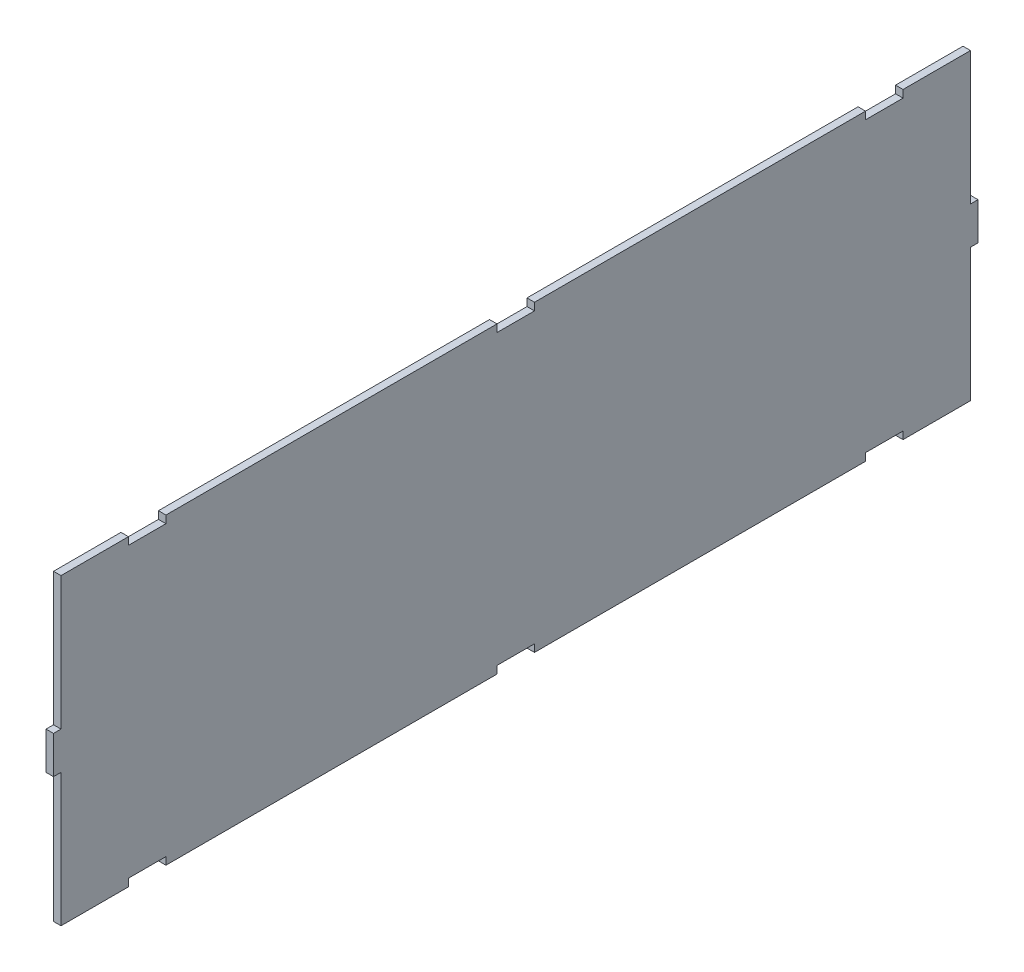
ISO-10303-21;
HEADER;
FILE_DESCRIPTION(('STEP AP214'),'2;1');
FILE_NAME('part.step','',(''),(''),'','','');
FILE_SCHEMA(('AUTOMOTIVE_DESIGN { 1 0 10303 214 1 1 1 1 }'));
ENDSEC;
DATA;
#1=APPLICATION_CONTEXT('core data for automotive mechanical design processes');
#2=APPLICATION_PROTOCOL_DEFINITION('international standard','automotive_design',2000,#1);
#3=PRODUCT_CONTEXT('',#1,'mechanical');
#4=PRODUCT('Part','Part','',(#3));
#5=PRODUCT_RELATED_PRODUCT_CATEGORY('part','',(#4));
#6=PRODUCT_DEFINITION_FORMATION('','',#4);
#7=PRODUCT_DEFINITION_CONTEXT('part definition',#1,'design');
#8=PRODUCT_DEFINITION('design','',#6,#7);
#9=PRODUCT_DEFINITION_SHAPE('','',#8);
#10=(LENGTH_UNIT() NAMED_UNIT(*) SI_UNIT(.MILLI.,.METRE.));
#11=(NAMED_UNIT(*) PLANE_ANGLE_UNIT() SI_UNIT($,.RADIAN.));
#12=(NAMED_UNIT(*) SI_UNIT($,.STERADIAN.) SOLID_ANGLE_UNIT());
#13=UNCERTAINTY_MEASURE_WITH_UNIT(LENGTH_MEASURE(1.E-05),#10,'distance_accuracy_value','');
#14=(GEOMETRIC_REPRESENTATION_CONTEXT(3) GLOBAL_UNCERTAINTY_ASSIGNED_CONTEXT((#13)) GLOBAL_UNIT_ASSIGNED_CONTEXT((#10,
#11,#12)) REPRESENTATION_CONTEXT('',''));
#15=CARTESIAN_POINT('',(0.,0.,0.));
#16=DIRECTION('',(0.,0.,1.));
#17=DIRECTION('',(1.,0.,0.));
#18=AXIS2_PLACEMENT_3D('',#15,#16,#17);
#19=CARTESIAN_POINT('',(3.,-53.19,-367.));
#20=DIRECTION('',(0.,0.,1.));
#21=DIRECTION('',(1.,0.,0.));
#22=AXIS2_PLACEMENT_3D('',#19,#20,#21);
#23=PLANE('',#22);
#24=DIRECTION('',(0.,1.,0.));
#25=VECTOR('',#24,1.);
#26=CARTESIAN_POINT('',(0.,-53.19,-367.));
#27=LINE('',#26,#25);
#28=CARTESIAN_POINT('',(0.,-53.19,-367.));
#29=VERTEX_POINT('',#28);
#30=CARTESIAN_POINT('',(0.,0.,-367.));
#31=VERTEX_POINT('',#30);
#32=EDGE_CURVE('E300',#29,#31,#27,.T.);
#33=ORIENTED_EDGE('',*,*,#32,.T.);
#34=DIRECTION('',(-1.,0.,0.));
#35=VECTOR('',#34,1.);
#36=CARTESIAN_POINT('',(3.,0.,-367.));
#37=LINE('',#36,#35);
#38=CARTESIAN_POINT('',(3.,0.,-367.));
#39=VERTEX_POINT('',#38);
#40=EDGE_CURVE('E11',#39,#31,#37,.T.);
#41=ORIENTED_EDGE('',*,*,#40,.F.);
#42=DIRECTION('',(0.,1.,0.));
#43=VECTOR('',#42,1.);
#44=CARTESIAN_POINT('',(3.,-53.19,-367.));
#45=LINE('',#44,#43);
#46=CARTESIAN_POINT('',(3.,-53.19,-367.));
#47=VERTEX_POINT('',#46);
#48=EDGE_CURVE('E370',#47,#39,#45,.T.);
#49=ORIENTED_EDGE('',*,*,#48,.F.);
#50=DIRECTION('',(-1.,0.,0.));
#51=VECTOR('',#50,1.);
#52=CARTESIAN_POINT('',(3.,-53.19,-367.));
#53=LINE('',#52,#51);
#54=EDGE_CURVE('E296',#47,#29,#53,.T.);
#55=ORIENTED_EDGE('',*,*,#54,.T.);
#56=EDGE_LOOP('',(#33,#41,#49,#55));
#57=FACE_BOUND('',#56,.T.);
#58=ADVANCED_FACE('F36',(#57),#23,.F.);
#59=CARTESIAN_POINT('',(3.,0.,-340.));
#60=DIRECTION('',(0.,-1.,0.));
#61=DIRECTION('',(0.,0.,-1.));
#62=AXIS2_PLACEMENT_3D('',#59,#60,#61);
#63=PLANE('',#62);
#64=DIRECTION('',(0.,0.,1.));
#65=VECTOR('',#64,1.);
#66=CARTESIAN_POINT('',(0.,0.,-340.));
#67=LINE('',#66,#65);
#68=CARTESIAN_POINT('',(0.,0.,-340.));
#69=VERTEX_POINT('',#68);
#70=EDGE_CURVE('E303',#31,#69,#67,.T.);
#71=ORIENTED_EDGE('',*,*,#70,.T.);
#72=DIRECTION('',(-1.,0.,0.));
#73=VECTOR('',#72,1.);
#74=CARTESIAN_POINT('',(3.,0.,-340.));
#75=LINE('',#74,#73);
#76=CARTESIAN_POINT('',(3.,0.,-340.));
#77=VERTEX_POINT('',#76);
#78=EDGE_CURVE('E44',#77,#69,#75,.T.);
#79=ORIENTED_EDGE('',*,*,#78,.F.);
#80=DIRECTION('',(0.,0.,1.));
#81=VECTOR('',#80,1.);
#82=CARTESIAN_POINT('',(3.,0.,-340.));
#83=LINE('',#82,#81);
#84=EDGE_CURVE('E179',#39,#77,#83,.T.);
#85=ORIENTED_EDGE('',*,*,#84,.F.);
#86=ORIENTED_EDGE('',*,*,#40,.T.);
#87=EDGE_LOOP('',(#71,#79,#85,#86));
#88=FACE_BOUND('',#87,.T.);
#89=ADVANCED_FACE('F568',(#88),#63,.F.);
#90=CARTESIAN_POINT('',(3.,0.,-340.));
#91=DIRECTION('',(0.,0.,-1.));
#92=DIRECTION('',(-1.,0.,0.));
#93=AXIS2_PLACEMENT_3D('',#90,#91,#92);
#94=PLANE('',#93);
#95=DIRECTION('',(0.,-1.,0.));
#96=VECTOR('',#95,1.);
#97=CARTESIAN_POINT('',(0.,0.,-340.));
#98=LINE('',#97,#96);
#99=CARTESIAN_POINT('',(0.,-3.,-340.));
#100=VERTEX_POINT('',#99);
#101=EDGE_CURVE('E305',#69,#100,#98,.T.);
#102=ORIENTED_EDGE('',*,*,#101,.T.);
#103=DIRECTION('',(-1.,0.,0.));
#104=VECTOR('',#103,1.);
#105=CARTESIAN_POINT('',(3.,-3.,-340.));
#106=LINE('',#105,#104);
#107=CARTESIAN_POINT('',(3.,-3.,-340.));
#108=VERTEX_POINT('',#107);
#109=EDGE_CURVE('E461',#108,#100,#106,.T.);
#110=ORIENTED_EDGE('',*,*,#109,.F.);
#111=DIRECTION('',(0.,-1.,0.));
#112=VECTOR('',#111,1.);
#113=CARTESIAN_POINT('',(3.,0.,-340.));
#114=LINE('',#113,#112);
#115=EDGE_CURVE('E469',#77,#108,#114,.T.);
#116=ORIENTED_EDGE('',*,*,#115,.F.);
#117=ORIENTED_EDGE('',*,*,#78,.T.);
#118=EDGE_LOOP('',(#102,#110,#116,#117));
#119=FACE_BOUND('',#118,.T.);
#120=ADVANCED_FACE('F467',(#119),#94,.F.);
#121=CARTESIAN_POINT('',(3.,-3.,-340.));
#122=DIRECTION('',(0.,-1.,0.));
#123=DIRECTION('',(0.,0.,-1.));
#124=AXIS2_PLACEMENT_3D('',#121,#122,#123);
#125=PLANE('',#124);
#126=DIRECTION('',(0.,0.,1.));
#127=VECTOR('',#126,1.);
#128=CARTESIAN_POINT('',(0.,-3.,-340.));
#129=LINE('',#128,#127);
#130=CARTESIAN_POINT('',(0.,-3.,-325.));
#131=VERTEX_POINT('',#130);
#132=EDGE_CURVE('E307',#100,#131,#129,.T.);
#133=ORIENTED_EDGE('',*,*,#132,.T.);
#134=DIRECTION('',(-1.,0.,0.));
#135=VECTOR('',#134,1.);
#136=CARTESIAN_POINT('',(3.,-3.,-325.));
#137=LINE('',#136,#135);
#138=CARTESIAN_POINT('',(3.,-3.,-325.));
#139=VERTEX_POINT('',#138);
#140=EDGE_CURVE('E458',#139,#131,#137,.T.);
#141=ORIENTED_EDGE('',*,*,#140,.F.);
#142=DIRECTION('',(0.,0.,1.));
#143=VECTOR('',#142,1.);
#144=CARTESIAN_POINT('',(3.,-3.,-340.));
#145=LINE('',#144,#143);
#146=EDGE_CURVE('E487',#108,#139,#145,.T.);
#147=ORIENTED_EDGE('',*,*,#146,.F.);
#148=ORIENTED_EDGE('',*,*,#109,.T.);
#149=EDGE_LOOP('',(#133,#141,#147,#148));
#150=FACE_BOUND('',#149,.T.);
#151=ADVANCED_FACE('F478',(#150),#125,.F.);
#152=CARTESIAN_POINT('',(3.,-3.,-325.));
#153=DIRECTION('',(0.,0.,1.));
#154=DIRECTION('',(1.,0.,0.));
#155=AXIS2_PLACEMENT_3D('',#152,#153,#154);
#156=PLANE('',#155);
#157=DIRECTION('',(0.,1.,0.));
#158=VECTOR('',#157,1.);
#159=CARTESIAN_POINT('',(0.,-3.,-325.));
#160=LINE('',#159,#158);
#161=CARTESIAN_POINT('',(0.,0.,-325.));
#162=VERTEX_POINT('',#161);
#163=EDGE_CURVE('E309',#131,#162,#160,.T.);
#164=ORIENTED_EDGE('',*,*,#163,.T.);
#165=DIRECTION('',(-1.,0.,0.));
#166=VECTOR('',#165,1.);
#167=CARTESIAN_POINT('',(3.,0.,-325.));
#168=LINE('',#167,#166);
#169=CARTESIAN_POINT('',(3.,0.,-325.));
#170=VERTEX_POINT('',#169);
#171=EDGE_CURVE('E455',#170,#162,#168,.T.);
#172=ORIENTED_EDGE('',*,*,#171,.F.);
#173=DIRECTION('',(0.,1.,0.));
#174=VECTOR('',#173,1.);
#175=CARTESIAN_POINT('',(3.,-3.,-325.));
#176=LINE('',#175,#174);
#177=EDGE_CURVE('E484',#139,#170,#176,.T.);
#178=ORIENTED_EDGE('',*,*,#177,.F.);
#179=ORIENTED_EDGE('',*,*,#140,.T.);
#180=EDGE_LOOP('',(#164,#172,#178,#179));
#181=FACE_BOUND('',#180,.T.);
#182=ADVANCED_FACE('F482',(#181),#156,.F.);
#183=CARTESIAN_POINT('',(3.,0.,-192.5));
#184=DIRECTION('',(0.,-1.,0.));
#185=DIRECTION('',(0.,0.,-1.));
#186=AXIS2_PLACEMENT_3D('',#183,#184,#185);
#187=PLANE('',#186);
#188=DIRECTION('',(0.,0.,1.));
#189=VECTOR('',#188,1.);
#190=CARTESIAN_POINT('',(0.,0.,-192.5));
#191=LINE('',#190,#189);
#192=CARTESIAN_POINT('',(0.,0.,-192.5));
#193=VERTEX_POINT('',#192);
#194=EDGE_CURVE('E311',#162,#193,#191,.T.);
#195=ORIENTED_EDGE('',*,*,#194,.T.);
#196=DIRECTION('',(-1.,0.,0.));
#197=VECTOR('',#196,1.);
#198=CARTESIAN_POINT('',(3.,0.,-192.5));
#199=LINE('',#198,#197);
#200=CARTESIAN_POINT('',(3.,0.,-192.5));
#201=VERTEX_POINT('',#200);
#202=EDGE_CURVE('E452',#201,#193,#199,.T.);
#203=ORIENTED_EDGE('',*,*,#202,.F.);
#204=DIRECTION('',(0.,0.,1.));
#205=VECTOR('',#204,1.);
#206=CARTESIAN_POINT('',(3.,0.,-192.5));
#207=LINE('',#206,#205);
#208=EDGE_CURVE('E486',#170,#201,#207,.T.);
#209=ORIENTED_EDGE('',*,*,#208,.F.);
#210=ORIENTED_EDGE('',*,*,#171,.T.);
#211=EDGE_LOOP('',(#195,#203,#209,#210));
#212=FACE_BOUND('',#211,.T.);
#213=ADVANCED_FACE('F581',(#212),#187,.F.);
#214=CARTESIAN_POINT('',(3.,-3.,-192.5));
#215=DIRECTION('',(0.,0.,-1.));
#216=DIRECTION('',(-1.,0.,0.));
#217=AXIS2_PLACEMENT_3D('',#214,#215,#216);
#218=PLANE('',#217);
#219=DIRECTION('',(0.,-1.,0.));
#220=VECTOR('',#219,1.);
#221=CARTESIAN_POINT('',(0.,-3.,-192.5));
#222=LINE('',#221,#220);
#223=CARTESIAN_POINT('',(0.,-3.,-192.5));
#224=VERTEX_POINT('',#223);
#225=EDGE_CURVE('E313',#193,#224,#222,.T.);
#226=ORIENTED_EDGE('',*,*,#225,.T.);
#227=DIRECTION('',(-1.,0.,0.));
#228=VECTOR('',#227,1.);
#229=CARTESIAN_POINT('',(3.,-3.,-192.5));
#230=LINE('',#229,#228);
#231=CARTESIAN_POINT('',(3.,-3.,-192.5));
#232=VERTEX_POINT('',#231);
#233=EDGE_CURVE('E449',#232,#224,#230,.T.);
#234=ORIENTED_EDGE('',*,*,#233,.F.);
#235=DIRECTION('',(0.,-1.,0.));
#236=VECTOR('',#235,1.);
#237=CARTESIAN_POINT('',(3.,-3.,-192.5));
#238=LINE('',#237,#236);
#239=EDGE_CURVE('E489',#201,#232,#238,.T.);
#240=ORIENTED_EDGE('',*,*,#239,.F.);
#241=ORIENTED_EDGE('',*,*,#202,.T.);
#242=EDGE_LOOP('',(#226,#234,#240,#241));
#243=FACE_BOUND('',#242,.T.);
#244=ADVANCED_FACE('F584',(#243),#218,.F.);
#245=CARTESIAN_POINT('',(3.,-3.,-177.5));
#246=DIRECTION('',(0.,-1.,0.));
#247=DIRECTION('',(0.,0.,-1.));
#248=AXIS2_PLACEMENT_3D('',#245,#246,#247);
#249=PLANE('',#248);
#250=DIRECTION('',(0.,0.,1.));
#251=VECTOR('',#250,1.);
#252=CARTESIAN_POINT('',(0.,-3.,-177.5));
#253=LINE('',#252,#251);
#254=CARTESIAN_POINT('',(0.,-3.,-177.5));
#255=VERTEX_POINT('',#254);
#256=EDGE_CURVE('E315',#224,#255,#253,.T.);
#257=ORIENTED_EDGE('',*,*,#256,.T.);
#258=DIRECTION('',(-1.,0.,0.));
#259=VECTOR('',#258,1.);
#260=CARTESIAN_POINT('',(3.,-3.,-177.5));
#261=LINE('',#260,#259);
#262=CARTESIAN_POINT('',(3.,-3.,-177.5));
#263=VERTEX_POINT('',#262);
#264=EDGE_CURVE('E446',#263,#255,#261,.T.);
#265=ORIENTED_EDGE('',*,*,#264,.F.);
#266=DIRECTION('',(0.,0.,1.));
#267=VECTOR('',#266,1.);
#268=CARTESIAN_POINT('',(3.,-3.,-177.5));
#269=LINE('',#268,#267);
#270=EDGE_CURVE('E495',#232,#263,#269,.T.);
#271=ORIENTED_EDGE('',*,*,#270,.F.);
#272=ORIENTED_EDGE('',*,*,#233,.T.);
#273=EDGE_LOOP('',(#257,#265,#271,#272));
#274=FACE_BOUND('',#273,.T.);
#275=ADVANCED_FACE('F588',(#274),#249,.F.);
#276=CARTESIAN_POINT('',(3.,-3.,-177.5));
#277=DIRECTION('',(0.,0.,1.));
#278=DIRECTION('',(1.,0.,0.));
#279=AXIS2_PLACEMENT_3D('',#276,#277,#278);
#280=PLANE('',#279);
#281=DIRECTION('',(0.,1.,0.));
#282=VECTOR('',#281,1.);
#283=CARTESIAN_POINT('',(0.,-3.,-177.5));
#284=LINE('',#283,#282);
#285=CARTESIAN_POINT('',(0.,0.,-177.5));
#286=VERTEX_POINT('',#285);
#287=EDGE_CURVE('E317',#255,#286,#284,.T.);
#288=ORIENTED_EDGE('',*,*,#287,.T.);
#289=DIRECTION('',(-1.,0.,0.));
#290=VECTOR('',#289,1.);
#291=CARTESIAN_POINT('',(3.,0.,-177.5));
#292=LINE('',#291,#290);
#293=CARTESIAN_POINT('',(3.,0.,-177.5));
#294=VERTEX_POINT('',#293);
#295=EDGE_CURVE('E443',#294,#286,#292,.T.);
#296=ORIENTED_EDGE('',*,*,#295,.F.);
#297=DIRECTION('',(0.,1.,0.));
#298=VECTOR('',#297,1.);
#299=CARTESIAN_POINT('',(3.,-3.,-177.5));
#300=LINE('',#299,#298);
#301=EDGE_CURVE('E497',#263,#294,#300,.T.);
#302=ORIENTED_EDGE('',*,*,#301,.F.);
#303=ORIENTED_EDGE('',*,*,#264,.T.);
#304=EDGE_LOOP('',(#288,#296,#302,#303));
#305=FACE_BOUND('',#304,.T.);
#306=ADVANCED_FACE('F592',(#305),#280,.F.);
#307=CARTESIAN_POINT('',(3.,0.,-45.));
#308=DIRECTION('',(0.,-1.,0.));
#309=DIRECTION('',(0.,0.,-1.));
#310=AXIS2_PLACEMENT_3D('',#307,#308,#309);
#311=PLANE('',#310);
#312=DIRECTION('',(0.,0.,1.));
#313=VECTOR('',#312,1.);
#314=CARTESIAN_POINT('',(0.,0.,-45.));
#315=LINE('',#314,#313);
#316=CARTESIAN_POINT('',(0.,0.,-45.));
#317=VERTEX_POINT('',#316);
#318=EDGE_CURVE('E319',#286,#317,#315,.T.);
#319=ORIENTED_EDGE('',*,*,#318,.T.);
#320=DIRECTION('',(-1.,0.,0.));
#321=VECTOR('',#320,1.);
#322=CARTESIAN_POINT('',(3.,0.,-45.));
#323=LINE('',#322,#321);
#324=CARTESIAN_POINT('',(3.,0.,-45.));
#325=VERTEX_POINT('',#324);
#326=EDGE_CURVE('E440',#325,#317,#323,.T.);
#327=ORIENTED_EDGE('',*,*,#326,.F.);
#328=DIRECTION('',(0.,0.,1.));
#329=VECTOR('',#328,1.);
#330=CARTESIAN_POINT('',(3.,0.,-45.));
#331=LINE('',#330,#329);
#332=EDGE_CURVE('E499',#294,#325,#331,.T.);
#333=ORIENTED_EDGE('',*,*,#332,.F.);
#334=ORIENTED_EDGE('',*,*,#295,.T.);
#335=EDGE_LOOP('',(#319,#327,#333,#334));
#336=FACE_BOUND('',#335,.T.);
#337=ADVANCED_FACE('F596',(#336),#311,.F.);
#338=CARTESIAN_POINT('',(3.,-3.,-45.));
#339=DIRECTION('',(0.,0.,-1.));
#340=DIRECTION('',(-1.,0.,0.));
#341=AXIS2_PLACEMENT_3D('',#338,#339,#340);
#342=PLANE('',#341);
#343=DIRECTION('',(0.,-1.,0.));
#344=VECTOR('',#343,1.);
#345=CARTESIAN_POINT('',(0.,-3.,-45.));
#346=LINE('',#345,#344);
#347=CARTESIAN_POINT('',(0.,-3.,-45.));
#348=VERTEX_POINT('',#347);
#349=EDGE_CURVE('E321',#317,#348,#346,.T.);
#350=ORIENTED_EDGE('',*,*,#349,.T.);
#351=DIRECTION('',(-1.,0.,0.));
#352=VECTOR('',#351,1.);
#353=CARTESIAN_POINT('',(3.,-3.,-45.));
#354=LINE('',#353,#352);
#355=CARTESIAN_POINT('',(3.,-3.,-45.));
#356=VERTEX_POINT('',#355);
#357=EDGE_CURVE('E437',#356,#348,#354,.T.);
#358=ORIENTED_EDGE('',*,*,#357,.F.);
#359=DIRECTION('',(0.,-1.,0.));
#360=VECTOR('',#359,1.);
#361=CARTESIAN_POINT('',(3.,-3.,-45.));
#362=LINE('',#361,#360);
#363=EDGE_CURVE('E501',#325,#356,#362,.T.);
#364=ORIENTED_EDGE('',*,*,#363,.F.);
#365=ORIENTED_EDGE('',*,*,#326,.T.);
#366=EDGE_LOOP('',(#350,#358,#364,#365));
#367=FACE_BOUND('',#366,.T.);
#368=ADVANCED_FACE('F600',(#367),#342,.F.);
#369=CARTESIAN_POINT('',(3.,-3.,-30.));
#370=DIRECTION('',(0.,-1.,0.));
#371=DIRECTION('',(0.,0.,-1.));
#372=AXIS2_PLACEMENT_3D('',#369,#370,#371);
#373=PLANE('',#372);
#374=DIRECTION('',(0.,0.,1.));
#375=VECTOR('',#374,1.);
#376=CARTESIAN_POINT('',(0.,-3.,-30.));
#377=LINE('',#376,#375);
#378=CARTESIAN_POINT('',(0.,-3.,-30.));
#379=VERTEX_POINT('',#378);
#380=EDGE_CURVE('E323',#348,#379,#377,.T.);
#381=ORIENTED_EDGE('',*,*,#380,.T.);
#382=DIRECTION('',(-1.,0.,0.));
#383=VECTOR('',#382,1.);
#384=CARTESIAN_POINT('',(3.,-3.,-30.));
#385=LINE('',#384,#383);
#386=CARTESIAN_POINT('',(3.,-3.,-30.));
#387=VERTEX_POINT('',#386);
#388=EDGE_CURVE('E434',#387,#379,#385,.T.);
#389=ORIENTED_EDGE('',*,*,#388,.F.);
#390=DIRECTION('',(0.,0.,1.));
#391=VECTOR('',#390,1.);
#392=CARTESIAN_POINT('',(3.,-3.,-30.));
#393=LINE('',#392,#391);
#394=EDGE_CURVE('E503',#356,#387,#393,.T.);
#395=ORIENTED_EDGE('',*,*,#394,.F.);
#396=ORIENTED_EDGE('',*,*,#357,.T.);
#397=EDGE_LOOP('',(#381,#389,#395,#396));
#398=FACE_BOUND('',#397,.T.);
#399=ADVANCED_FACE('F604',(#398),#373,.F.);
#400=CARTESIAN_POINT('',(3.,0.,-30.));
#401=DIRECTION('',(0.,0.,1.));
#402=DIRECTION('',(1.,0.,0.));
#403=AXIS2_PLACEMENT_3D('',#400,#401,#402);
#404=PLANE('',#403);
#405=DIRECTION('',(0.,1.,0.));
#406=VECTOR('',#405,1.);
#407=CARTESIAN_POINT('',(0.,0.,-30.));
#408=LINE('',#407,#406);
#409=CARTESIAN_POINT('',(0.,0.,-30.));
#410=VERTEX_POINT('',#409);
#411=EDGE_CURVE('E325',#379,#410,#408,.T.);
#412=ORIENTED_EDGE('',*,*,#411,.T.);
#413=DIRECTION('',(-1.,0.,0.));
#414=VECTOR('',#413,1.);
#415=CARTESIAN_POINT('',(3.,0.,-30.));
#416=LINE('',#415,#414);
#417=CARTESIAN_POINT('',(3.,0.,-30.));
#418=VERTEX_POINT('',#417);
#419=EDGE_CURVE('E431',#418,#410,#416,.T.);
#420=ORIENTED_EDGE('',*,*,#419,.F.);
#421=DIRECTION('',(0.,1.,0.));
#422=VECTOR('',#421,1.);
#423=CARTESIAN_POINT('',(3.,0.,-30.));
#424=LINE('',#423,#422);
#425=EDGE_CURVE('E505',#387,#418,#424,.T.);
#426=ORIENTED_EDGE('',*,*,#425,.F.);
#427=ORIENTED_EDGE('',*,*,#388,.T.);
#428=EDGE_LOOP('',(#412,#420,#426,#427));
#429=FACE_BOUND('',#428,.T.);
#430=ADVANCED_FACE('F608',(#429),#404,.F.);
#431=CARTESIAN_POINT('',(3.,0.,-3.));
#432=DIRECTION('',(0.,-1.,0.));
#433=DIRECTION('',(0.,0.,-1.));
#434=AXIS2_PLACEMENT_3D('',#431,#432,#433);
#435=PLANE('',#434);
#436=DIRECTION('',(0.,0.,1.));
#437=VECTOR('',#436,1.);
#438=CARTESIAN_POINT('',(0.,0.,-3.));
#439=LINE('',#438,#437);
#440=CARTESIAN_POINT('',(0.,0.,-3.));
#441=VERTEX_POINT('',#440);
#442=EDGE_CURVE('E327',#410,#441,#439,.T.);
#443=ORIENTED_EDGE('',*,*,#442,.T.);
#444=DIRECTION('',(-1.,0.,0.));
#445=VECTOR('',#444,1.);
#446=CARTESIAN_POINT('',(3.,0.,-3.));
#447=LINE('',#446,#445);
#448=CARTESIAN_POINT('',(3.,0.,-3.));
#449=VERTEX_POINT('',#448);
#450=EDGE_CURVE('E428',#449,#441,#447,.T.);
#451=ORIENTED_EDGE('',*,*,#450,.F.);
#452=DIRECTION('',(0.,0.,1.));
#453=VECTOR('',#452,1.);
#454=CARTESIAN_POINT('',(3.,0.,-3.));
#455=LINE('',#454,#453);
#456=EDGE_CURVE('E507',#418,#449,#455,.T.);
#457=ORIENTED_EDGE('',*,*,#456,.F.);
#458=ORIENTED_EDGE('',*,*,#419,.T.);
#459=EDGE_LOOP('',(#443,#451,#457,#458));
#460=FACE_BOUND('',#459,.T.);
#461=ADVANCED_FACE('F612',(#460),#435,.F.);
#462=CARTESIAN_POINT('',(3.,-53.19,-3.));
#463=DIRECTION('',(0.,0.,-1.));
#464=DIRECTION('',(-1.,0.,0.));
#465=AXIS2_PLACEMENT_3D('',#462,#463,#464);
#466=PLANE('',#465);
#467=DIRECTION('',(0.,-1.,0.));
#468=VECTOR('',#467,1.);
#469=CARTESIAN_POINT('',(0.,-53.19,-3.));
#470=LINE('',#469,#468);
#471=CARTESIAN_POINT('',(0.,-53.19,-3.));
#472=VERTEX_POINT('',#471);
#473=EDGE_CURVE('E329',#441,#472,#470,.T.);
#474=ORIENTED_EDGE('',*,*,#473,.T.);
#475=DIRECTION('',(-1.,0.,0.));
#476=VECTOR('',#475,1.);
#477=CARTESIAN_POINT('',(3.,-53.19,-3.));
#478=LINE('',#477,#476);
#479=CARTESIAN_POINT('',(3.,-53.19,-3.));
#480=VERTEX_POINT('',#479);
#481=EDGE_CURVE('E425',#480,#472,#478,.T.);
#482=ORIENTED_EDGE('',*,*,#481,.F.);
#483=DIRECTION('',(0.,-1.,0.));
#484=VECTOR('',#483,1.);
#485=CARTESIAN_POINT('',(3.,-53.19,-3.));
#486=LINE('',#485,#484);
#487=EDGE_CURVE('E509',#449,#480,#486,.T.);
#488=ORIENTED_EDGE('',*,*,#487,.F.);
#489=ORIENTED_EDGE('',*,*,#450,.T.);
#490=EDGE_LOOP('',(#474,#482,#488,#489));
#491=FACE_BOUND('',#490,.T.);
#492=ADVANCED_FACE('F616',(#491),#466,.F.);
#493=CARTESIAN_POINT('',(3.,-53.19,-3.));
#494=DIRECTION('',(0.,-1.,0.));
#495=DIRECTION('',(0.,0.,-1.));
#496=AXIS2_PLACEMENT_3D('',#493,#494,#495);
#497=PLANE('',#496);
#498=DIRECTION('',(0.,0.,1.));
#499=VECTOR('',#498,1.);
#500=CARTESIAN_POINT('',(0.,-53.19,-3.));
#501=LINE('',#500,#499);
#502=CARTESIAN_POINT('',(0.,-53.19,0.));
#503=VERTEX_POINT('',#502);
#504=EDGE_CURVE('E331',#472,#503,#501,.T.);
#505=ORIENTED_EDGE('',*,*,#504,.T.);
#506=DIRECTION('',(-1.,0.,0.));
#507=VECTOR('',#506,1.);
#508=CARTESIAN_POINT('',(3.,-53.19,0.));
#509=LINE('',#508,#507);
#510=CARTESIAN_POINT('',(3.,-53.19,0.));
#511=VERTEX_POINT('',#510);
#512=EDGE_CURVE('E422',#511,#503,#509,.T.);
#513=ORIENTED_EDGE('',*,*,#512,.F.);
#514=DIRECTION('',(0.,0.,1.));
#515=VECTOR('',#514,1.);
#516=CARTESIAN_POINT('',(3.,-53.19,-3.));
#517=LINE('',#516,#515);
#518=EDGE_CURVE('E511',#480,#511,#517,.T.);
#519=ORIENTED_EDGE('',*,*,#518,.F.);
#520=ORIENTED_EDGE('',*,*,#481,.T.);
#521=EDGE_LOOP('',(#505,#513,#519,#520));
#522=FACE_BOUND('',#521,.T.);
#523=ADVANCED_FACE('F620',(#522),#497,.F.);
#524=CARTESIAN_POINT('',(3.,-53.19,0.));
#525=DIRECTION('',(0.,0.,-1.));
#526=DIRECTION('',(-1.,0.,0.));
#527=AXIS2_PLACEMENT_3D('',#524,#525,#526);
#528=PLANE('',#527);
#529=DIRECTION('',(0.,-1.,0.));
#530=VECTOR('',#529,1.);
#531=CARTESIAN_POINT('',(0.,-53.19,0.));
#532=LINE('',#531,#530);
#533=CARTESIAN_POINT('',(0.,-68.19,0.));
#534=VERTEX_POINT('',#533);
#535=EDGE_CURVE('E333',#503,#534,#532,.T.);
#536=ORIENTED_EDGE('',*,*,#535,.T.);
#537=DIRECTION('',(-1.,0.,0.));
#538=VECTOR('',#537,1.);
#539=CARTESIAN_POINT('',(3.,-68.19,0.));
#540=LINE('',#539,#538);
#541=CARTESIAN_POINT('',(3.,-68.19,0.));
#542=VERTEX_POINT('',#541);
#543=EDGE_CURVE('E419',#542,#534,#540,.T.);
#544=ORIENTED_EDGE('',*,*,#543,.F.);
#545=DIRECTION('',(0.,-1.,0.));
#546=VECTOR('',#545,1.);
#547=CARTESIAN_POINT('',(3.,-53.19,0.));
#548=LINE('',#547,#546);
#549=EDGE_CURVE('E513',#511,#542,#548,.T.);
#550=ORIENTED_EDGE('',*,*,#549,.F.);
#551=ORIENTED_EDGE('',*,*,#512,.T.);
#552=EDGE_LOOP('',(#536,#544,#550,#551));
#553=FACE_BOUND('',#552,.T.);
#554=ADVANCED_FACE('F624',(#553),#528,.F.);
#555=CARTESIAN_POINT('',(3.,-68.19,-3.));
#556=DIRECTION('',(0.,1.,0.));
#557=DIRECTION('',(0.,0.,1.));
#558=AXIS2_PLACEMENT_3D('',#555,#556,#557);
#559=PLANE('',#558);
#560=DIRECTION('',(0.,0.,-1.));
#561=VECTOR('',#560,1.);
#562=CARTESIAN_POINT('',(0.,-68.19,-3.));
#563=LINE('',#562,#561);
#564=CARTESIAN_POINT('',(0.,-68.19,-3.));
#565=VERTEX_POINT('',#564);
#566=EDGE_CURVE('E335',#534,#565,#563,.T.);
#567=ORIENTED_EDGE('',*,*,#566,.T.);
#568=DIRECTION('',(-1.,0.,0.));
#569=VECTOR('',#568,1.);
#570=CARTESIAN_POINT('',(3.,-68.19,-3.));
#571=LINE('',#570,#569);
#572=CARTESIAN_POINT('',(3.,-68.19,-3.));
#573=VERTEX_POINT('',#572);
#574=EDGE_CURVE('E416',#573,#565,#571,.T.);
#575=ORIENTED_EDGE('',*,*,#574,.F.);
#576=DIRECTION('',(0.,0.,-1.));
#577=VECTOR('',#576,1.);
#578=CARTESIAN_POINT('',(3.,-68.19,-3.));
#579=LINE('',#578,#577);
#580=EDGE_CURVE('E515',#542,#573,#579,.T.);
#581=ORIENTED_EDGE('',*,*,#580,.F.);
#582=ORIENTED_EDGE('',*,*,#543,.T.);
#583=EDGE_LOOP('',(#567,#575,#581,#582));
#584=FACE_BOUND('',#583,.T.);
#585=ADVANCED_FACE('F628',(#584),#559,.F.);
#586=CARTESIAN_POINT('',(3.,-68.19,-3.));
#587=DIRECTION('',(0.,0.,-1.));
#588=DIRECTION('',(-1.,0.,0.));
#589=AXIS2_PLACEMENT_3D('',#586,#587,#588);
#590=PLANE('',#589);
#591=DIRECTION('',(0.,-1.,0.));
#592=VECTOR('',#591,1.);
#593=CARTESIAN_POINT('',(0.,-68.19,-3.));
#594=LINE('',#593,#592);
#595=CARTESIAN_POINT('',(0.,-121.38,-3.));
#596=VERTEX_POINT('',#595);
#597=EDGE_CURVE('E337',#565,#596,#594,.T.);
#598=ORIENTED_EDGE('',*,*,#597,.T.);
#599=DIRECTION('',(-1.,0.,0.));
#600=VECTOR('',#599,1.);
#601=CARTESIAN_POINT('',(3.,-121.38,-3.));
#602=LINE('',#601,#600);
#603=CARTESIAN_POINT('',(3.,-121.38,-3.));
#604=VERTEX_POINT('',#603);
#605=EDGE_CURVE('E413',#604,#596,#602,.T.);
#606=ORIENTED_EDGE('',*,*,#605,.F.);
#607=DIRECTION('',(0.,-1.,0.));
#608=VECTOR('',#607,1.);
#609=CARTESIAN_POINT('',(3.,-68.19,-3.));
#610=LINE('',#609,#608);
#611=EDGE_CURVE('E517',#573,#604,#610,.T.);
#612=ORIENTED_EDGE('',*,*,#611,.F.);
#613=ORIENTED_EDGE('',*,*,#574,.T.);
#614=EDGE_LOOP('',(#598,#606,#612,#613));
#615=FACE_BOUND('',#614,.T.);
#616=ADVANCED_FACE('F632',(#615),#590,.F.);
#617=CARTESIAN_POINT('',(3.,-121.38,-3.));
#618=DIRECTION('',(0.,1.,0.));
#619=DIRECTION('',(0.,0.,1.));
#620=AXIS2_PLACEMENT_3D('',#617,#618,#619);
#621=PLANE('',#620);
#622=DIRECTION('',(0.,0.,-1.));
#623=VECTOR('',#622,1.);
#624=CARTESIAN_POINT('',(0.,-121.38,-3.));
#625=LINE('',#624,#623);
#626=CARTESIAN_POINT('',(0.,-121.38,-30.));
#627=VERTEX_POINT('',#626);
#628=EDGE_CURVE('E339',#596,#627,#625,.T.);
#629=ORIENTED_EDGE('',*,*,#628,.T.);
#630=DIRECTION('',(-1.,0.,0.));
#631=VECTOR('',#630,1.);
#632=CARTESIAN_POINT('',(3.,-121.38,-30.));
#633=LINE('',#632,#631);
#634=CARTESIAN_POINT('',(3.,-121.38,-30.));
#635=VERTEX_POINT('',#634);
#636=EDGE_CURVE('E410',#635,#627,#633,.T.);
#637=ORIENTED_EDGE('',*,*,#636,.F.);
#638=DIRECTION('',(0.,0.,-1.));
#639=VECTOR('',#638,1.);
#640=CARTESIAN_POINT('',(3.,-121.38,-3.));
#641=LINE('',#640,#639);
#642=EDGE_CURVE('E519',#604,#635,#641,.T.);
#643=ORIENTED_EDGE('',*,*,#642,.F.);
#644=ORIENTED_EDGE('',*,*,#605,.T.);
#645=EDGE_LOOP('',(#629,#637,#643,#644));
#646=FACE_BOUND('',#645,.T.);
#647=ADVANCED_FACE('F636',(#646),#621,.F.);
#648=CARTESIAN_POINT('',(3.,-121.38,-30.));
#649=DIRECTION('',(0.,0.,1.));
#650=DIRECTION('',(1.,0.,0.));
#651=AXIS2_PLACEMENT_3D('',#648,#649,#650);
#652=PLANE('',#651);
#653=DIRECTION('',(0.,1.,0.));
#654=VECTOR('',#653,1.);
#655=CARTESIAN_POINT('',(0.,-121.38,-30.));
#656=LINE('',#655,#654);
#657=CARTESIAN_POINT('',(0.,-118.38,-30.));
#658=VERTEX_POINT('',#657);
#659=EDGE_CURVE('E341',#627,#658,#656,.T.);
#660=ORIENTED_EDGE('',*,*,#659,.T.);
#661=DIRECTION('',(-1.,0.,0.));
#662=VECTOR('',#661,1.);
#663=CARTESIAN_POINT('',(3.,-118.38,-30.));
#664=LINE('',#663,#662);
#665=CARTESIAN_POINT('',(3.,-118.38,-30.));
#666=VERTEX_POINT('',#665);
#667=EDGE_CURVE('E407',#666,#658,#664,.T.);
#668=ORIENTED_EDGE('',*,*,#667,.F.);
#669=DIRECTION('',(0.,1.,0.));
#670=VECTOR('',#669,1.);
#671=CARTESIAN_POINT('',(3.,-121.38,-30.));
#672=LINE('',#671,#670);
#673=EDGE_CURVE('E521',#635,#666,#672,.T.);
#674=ORIENTED_EDGE('',*,*,#673,.F.);
#675=ORIENTED_EDGE('',*,*,#636,.T.);
#676=EDGE_LOOP('',(#660,#668,#674,#675));
#677=FACE_BOUND('',#676,.T.);
#678=ADVANCED_FACE('F640',(#677),#652,.F.);
#679=CARTESIAN_POINT('',(3.,-118.38,-30.));
#680=DIRECTION('',(0.,1.,0.));
#681=DIRECTION('',(0.,0.,1.));
#682=AXIS2_PLACEMENT_3D('',#679,#680,#681);
#683=PLANE('',#682);
#684=DIRECTION('',(0.,0.,-1.));
#685=VECTOR('',#684,1.);
#686=CARTESIAN_POINT('',(0.,-118.38,-30.));
#687=LINE('',#686,#685);
#688=CARTESIAN_POINT('',(0.,-118.38,-45.));
#689=VERTEX_POINT('',#688);
#690=EDGE_CURVE('E343',#658,#689,#687,.T.);
#691=ORIENTED_EDGE('',*,*,#690,.T.);
#692=DIRECTION('',(-1.,0.,0.));
#693=VECTOR('',#692,1.);
#694=CARTESIAN_POINT('',(3.,-118.38,-45.));
#695=LINE('',#694,#693);
#696=CARTESIAN_POINT('',(3.,-118.38,-45.));
#697=VERTEX_POINT('',#696);
#698=EDGE_CURVE('E404',#697,#689,#695,.T.);
#699=ORIENTED_EDGE('',*,*,#698,.F.);
#700=DIRECTION('',(0.,0.,-1.));
#701=VECTOR('',#700,1.);
#702=CARTESIAN_POINT('',(3.,-118.38,-30.));
#703=LINE('',#702,#701);
#704=EDGE_CURVE('E523',#666,#697,#703,.T.);
#705=ORIENTED_EDGE('',*,*,#704,.F.);
#706=ORIENTED_EDGE('',*,*,#667,.T.);
#707=EDGE_LOOP('',(#691,#699,#705,#706));
#708=FACE_BOUND('',#707,.T.);
#709=ADVANCED_FACE('F644',(#708),#683,.F.);
#710=CARTESIAN_POINT('',(3.,-118.38,-45.));
#711=DIRECTION('',(0.,0.,-1.));
#712=DIRECTION('',(-1.,0.,0.));
#713=AXIS2_PLACEMENT_3D('',#710,#711,#712);
#714=PLANE('',#713);
#715=DIRECTION('',(0.,-1.,0.));
#716=VECTOR('',#715,1.);
#717=CARTESIAN_POINT('',(0.,-118.38,-45.));
#718=LINE('',#717,#716);
#719=CARTESIAN_POINT('',(0.,-121.38,-45.));
#720=VERTEX_POINT('',#719);
#721=EDGE_CURVE('E345',#689,#720,#718,.T.);
#722=ORIENTED_EDGE('',*,*,#721,.T.);
#723=DIRECTION('',(-1.,0.,0.));
#724=VECTOR('',#723,1.);
#725=CARTESIAN_POINT('',(3.,-121.38,-45.));
#726=LINE('',#725,#724);
#727=CARTESIAN_POINT('',(3.,-121.38,-45.));
#728=VERTEX_POINT('',#727);
#729=EDGE_CURVE('E401',#728,#720,#726,.T.);
#730=ORIENTED_EDGE('',*,*,#729,.F.);
#731=DIRECTION('',(0.,-1.,0.));
#732=VECTOR('',#731,1.);
#733=CARTESIAN_POINT('',(3.,-118.38,-45.));
#734=LINE('',#733,#732);
#735=EDGE_CURVE('E525',#697,#728,#734,.T.);
#736=ORIENTED_EDGE('',*,*,#735,.F.);
#737=ORIENTED_EDGE('',*,*,#698,.T.);
#738=EDGE_LOOP('',(#722,#730,#736,#737));
#739=FACE_BOUND('',#738,.T.);
#740=ADVANCED_FACE('F648',(#739),#714,.F.);
#741=CARTESIAN_POINT('',(3.,-121.38,-45.));
#742=DIRECTION('',(0.,1.,0.));
#743=DIRECTION('',(0.,0.,1.));
#744=AXIS2_PLACEMENT_3D('',#741,#742,#743);
#745=PLANE('',#744);
#746=DIRECTION('',(0.,0.,-1.));
#747=VECTOR('',#746,1.);
#748=CARTESIAN_POINT('',(0.,-121.38,-45.));
#749=LINE('',#748,#747);
#750=CARTESIAN_POINT('',(0.,-121.38,-177.5));
#751=VERTEX_POINT('',#750);
#752=EDGE_CURVE('E347',#720,#751,#749,.T.);
#753=ORIENTED_EDGE('',*,*,#752,.T.);
#754=DIRECTION('',(-1.,0.,0.));
#755=VECTOR('',#754,1.);
#756=CARTESIAN_POINT('',(3.,-121.38,-177.5));
#757=LINE('',#756,#755);
#758=CARTESIAN_POINT('',(3.,-121.38,-177.5));
#759=VERTEX_POINT('',#758);
#760=EDGE_CURVE('E398',#759,#751,#757,.T.);
#761=ORIENTED_EDGE('',*,*,#760,.F.);
#762=DIRECTION('',(0.,0.,-1.));
#763=VECTOR('',#762,1.);
#764=CARTESIAN_POINT('',(3.,-121.38,-45.));
#765=LINE('',#764,#763);
#766=EDGE_CURVE('E527',#728,#759,#765,.T.);
#767=ORIENTED_EDGE('',*,*,#766,.F.);
#768=ORIENTED_EDGE('',*,*,#729,.T.);
#769=EDGE_LOOP('',(#753,#761,#767,#768));
#770=FACE_BOUND('',#769,.T.);
#771=ADVANCED_FACE('F652',(#770),#745,.F.);
#772=CARTESIAN_POINT('',(3.,-118.38,-177.5));
#773=DIRECTION('',(0.,0.,1.));
#774=DIRECTION('',(1.,0.,0.));
#775=AXIS2_PLACEMENT_3D('',#772,#773,#774);
#776=PLANE('',#775);
#777=DIRECTION('',(0.,1.,0.));
#778=VECTOR('',#777,1.);
#779=CARTESIAN_POINT('',(0.,-118.38,-177.5));
#780=LINE('',#779,#778);
#781=CARTESIAN_POINT('',(0.,-118.38,-177.5));
#782=VERTEX_POINT('',#781);
#783=EDGE_CURVE('E349',#751,#782,#780,.T.);
#784=ORIENTED_EDGE('',*,*,#783,.T.);
#785=DIRECTION('',(-1.,0.,0.));
#786=VECTOR('',#785,1.);
#787=CARTESIAN_POINT('',(3.,-118.38,-177.5));
#788=LINE('',#787,#786);
#789=CARTESIAN_POINT('',(3.,-118.38,-177.5));
#790=VERTEX_POINT('',#789);
#791=EDGE_CURVE('E395',#790,#782,#788,.T.);
#792=ORIENTED_EDGE('',*,*,#791,.F.);
#793=DIRECTION('',(0.,1.,0.));
#794=VECTOR('',#793,1.);
#795=CARTESIAN_POINT('',(3.,-118.38,-177.5));
#796=LINE('',#795,#794);
#797=EDGE_CURVE('E529',#759,#790,#796,.T.);
#798=ORIENTED_EDGE('',*,*,#797,.F.);
#799=ORIENTED_EDGE('',*,*,#760,.T.);
#800=EDGE_LOOP('',(#784,#792,#798,#799));
#801=FACE_BOUND('',#800,.T.);
#802=ADVANCED_FACE('F656',(#801),#776,.F.);
#803=CARTESIAN_POINT('',(3.,-118.38,-177.5));
#804=DIRECTION('',(0.,1.,0.));
#805=DIRECTION('',(0.,0.,1.));
#806=AXIS2_PLACEMENT_3D('',#803,#804,#805);
#807=PLANE('',#806);
#808=DIRECTION('',(0.,0.,-1.));
#809=VECTOR('',#808,1.);
#810=CARTESIAN_POINT('',(0.,-118.38,-177.5));
#811=LINE('',#810,#809);
#812=CARTESIAN_POINT('',(0.,-118.38,-192.5));
#813=VERTEX_POINT('',#812);
#814=EDGE_CURVE('E351',#782,#813,#811,.T.);
#815=ORIENTED_EDGE('',*,*,#814,.T.);
#816=DIRECTION('',(-1.,0.,0.));
#817=VECTOR('',#816,1.);
#818=CARTESIAN_POINT('',(3.,-118.38,-192.5));
#819=LINE('',#818,#817);
#820=CARTESIAN_POINT('',(3.,-118.38,-192.5));
#821=VERTEX_POINT('',#820);
#822=EDGE_CURVE('E392',#821,#813,#819,.T.);
#823=ORIENTED_EDGE('',*,*,#822,.F.);
#824=DIRECTION('',(0.,0.,-1.));
#825=VECTOR('',#824,1.);
#826=CARTESIAN_POINT('',(3.,-118.38,-177.5));
#827=LINE('',#826,#825);
#828=EDGE_CURVE('E531',#790,#821,#827,.T.);
#829=ORIENTED_EDGE('',*,*,#828,.F.);
#830=ORIENTED_EDGE('',*,*,#791,.T.);
#831=EDGE_LOOP('',(#815,#823,#829,#830));
#832=FACE_BOUND('',#831,.T.);
#833=ADVANCED_FACE('F660',(#832),#807,.F.);
#834=CARTESIAN_POINT('',(3.,-118.38,-192.5));
#835=DIRECTION('',(0.,0.,-1.));
#836=DIRECTION('',(-1.,0.,0.));
#837=AXIS2_PLACEMENT_3D('',#834,#835,#836);
#838=PLANE('',#837);
#839=DIRECTION('',(0.,-1.,0.));
#840=VECTOR('',#839,1.);
#841=CARTESIAN_POINT('',(0.,-118.38,-192.5));
#842=LINE('',#841,#840);
#843=CARTESIAN_POINT('',(0.,-121.38,-192.5));
#844=VERTEX_POINT('',#843);
#845=EDGE_CURVE('E353',#813,#844,#842,.T.);
#846=ORIENTED_EDGE('',*,*,#845,.T.);
#847=DIRECTION('',(-1.,0.,0.));
#848=VECTOR('',#847,1.);
#849=CARTESIAN_POINT('',(3.,-121.38,-192.5));
#850=LINE('',#849,#848);
#851=CARTESIAN_POINT('',(3.,-121.38,-192.5));
#852=VERTEX_POINT('',#851);
#853=EDGE_CURVE('E389',#852,#844,#850,.T.);
#854=ORIENTED_EDGE('',*,*,#853,.F.);
#855=DIRECTION('',(0.,-1.,0.));
#856=VECTOR('',#855,1.);
#857=CARTESIAN_POINT('',(3.,-118.38,-192.5));
#858=LINE('',#857,#856);
#859=EDGE_CURVE('E533',#821,#852,#858,.T.);
#860=ORIENTED_EDGE('',*,*,#859,.F.);
#861=ORIENTED_EDGE('',*,*,#822,.T.);
#862=EDGE_LOOP('',(#846,#854,#860,#861));
#863=FACE_BOUND('',#862,.T.);
#864=ADVANCED_FACE('F664',(#863),#838,.F.);
#865=CARTESIAN_POINT('',(3.,-121.38,-192.5));
#866=DIRECTION('',(0.,1.,0.));
#867=DIRECTION('',(0.,0.,1.));
#868=AXIS2_PLACEMENT_3D('',#865,#866,#867);
#869=PLANE('',#868);
#870=DIRECTION('',(0.,0.,-1.));
#871=VECTOR('',#870,1.);
#872=CARTESIAN_POINT('',(0.,-121.38,-192.5));
#873=LINE('',#872,#871);
#874=CARTESIAN_POINT('',(0.,-121.38,-325.));
#875=VERTEX_POINT('',#874);
#876=EDGE_CURVE('E355',#844,#875,#873,.T.);
#877=ORIENTED_EDGE('',*,*,#876,.T.);
#878=DIRECTION('',(-1.,0.,0.));
#879=VECTOR('',#878,1.);
#880=CARTESIAN_POINT('',(3.,-121.38,-325.));
#881=LINE('',#880,#879);
#882=CARTESIAN_POINT('',(3.,-121.38,-325.));
#883=VERTEX_POINT('',#882);
#884=EDGE_CURVE('E386',#883,#875,#881,.T.);
#885=ORIENTED_EDGE('',*,*,#884,.F.);
#886=DIRECTION('',(0.,0.,-1.));
#887=VECTOR('',#886,1.);
#888=CARTESIAN_POINT('',(3.,-121.38,-192.5));
#889=LINE('',#888,#887);
#890=EDGE_CURVE('E535',#852,#883,#889,.T.);
#891=ORIENTED_EDGE('',*,*,#890,.F.);
#892=ORIENTED_EDGE('',*,*,#853,.T.);
#893=EDGE_LOOP('',(#877,#885,#891,#892));
#894=FACE_BOUND('',#893,.T.);
#895=ADVANCED_FACE('F668',(#894),#869,.F.);
#896=CARTESIAN_POINT('',(3.,-118.38,-325.));
#897=DIRECTION('',(0.,0.,1.));
#898=DIRECTION('',(1.,0.,0.));
#899=AXIS2_PLACEMENT_3D('',#896,#897,#898);
#900=PLANE('',#899);
#901=DIRECTION('',(0.,1.,0.));
#902=VECTOR('',#901,1.);
#903=CARTESIAN_POINT('',(0.,-118.38,-325.));
#904=LINE('',#903,#902);
#905=CARTESIAN_POINT('',(0.,-118.38,-325.));
#906=VERTEX_POINT('',#905);
#907=EDGE_CURVE('E357',#875,#906,#904,.T.);
#908=ORIENTED_EDGE('',*,*,#907,.T.);
#909=DIRECTION('',(-1.,0.,0.));
#910=VECTOR('',#909,1.);
#911=CARTESIAN_POINT('',(3.,-118.38,-325.));
#912=LINE('',#911,#910);
#913=CARTESIAN_POINT('',(3.,-118.38,-325.));
#914=VERTEX_POINT('',#913);
#915=EDGE_CURVE('E383',#914,#906,#912,.T.);
#916=ORIENTED_EDGE('',*,*,#915,.F.);
#917=DIRECTION('',(0.,1.,0.));
#918=VECTOR('',#917,1.);
#919=CARTESIAN_POINT('',(3.,-118.38,-325.));
#920=LINE('',#919,#918);
#921=EDGE_CURVE('E537',#883,#914,#920,.T.);
#922=ORIENTED_EDGE('',*,*,#921,.F.);
#923=ORIENTED_EDGE('',*,*,#884,.T.);
#924=EDGE_LOOP('',(#908,#916,#922,#923));
#925=FACE_BOUND('',#924,.T.);
#926=ADVANCED_FACE('F672',(#925),#900,.F.);
#927=CARTESIAN_POINT('',(3.,-118.38,-340.));
#928=DIRECTION('',(0.,1.,0.));
#929=DIRECTION('',(0.,0.,1.));
#930=AXIS2_PLACEMENT_3D('',#927,#928,#929);
#931=PLANE('',#930);
#932=DIRECTION('',(0.,0.,-1.));
#933=VECTOR('',#932,1.);
#934=CARTESIAN_POINT('',(0.,-118.38,-340.));
#935=LINE('',#934,#933);
#936=CARTESIAN_POINT('',(0.,-118.38,-340.));
#937=VERTEX_POINT('',#936);
#938=EDGE_CURVE('E359',#906,#937,#935,.T.);
#939=ORIENTED_EDGE('',*,*,#938,.T.);
#940=DIRECTION('',(-1.,0.,0.));
#941=VECTOR('',#940,1.);
#942=CARTESIAN_POINT('',(3.,-118.38,-340.));
#943=LINE('',#942,#941);
#944=CARTESIAN_POINT('',(3.,-118.38,-340.));
#945=VERTEX_POINT('',#944);
#946=EDGE_CURVE('E380',#945,#937,#943,.T.);
#947=ORIENTED_EDGE('',*,*,#946,.F.);
#948=DIRECTION('',(0.,0.,-1.));
#949=VECTOR('',#948,1.);
#950=CARTESIAN_POINT('',(3.,-118.38,-340.));
#951=LINE('',#950,#949);
#952=EDGE_CURVE('E539',#914,#945,#951,.T.);
#953=ORIENTED_EDGE('',*,*,#952,.F.);
#954=ORIENTED_EDGE('',*,*,#915,.T.);
#955=EDGE_LOOP('',(#939,#947,#953,#954));
#956=FACE_BOUND('',#955,.T.);
#957=ADVANCED_FACE('F676',(#956),#931,.F.);
#958=CARTESIAN_POINT('',(3.,-121.38,-340.));
#959=DIRECTION('',(0.,0.,-1.));
#960=DIRECTION('',(-1.,0.,0.));
#961=AXIS2_PLACEMENT_3D('',#958,#959,#960);
#962=PLANE('',#961);
#963=DIRECTION('',(0.,-1.,0.));
#964=VECTOR('',#963,1.);
#965=CARTESIAN_POINT('',(0.,-121.38,-340.));
#966=LINE('',#965,#964);
#967=CARTESIAN_POINT('',(0.,-121.38,-340.));
#968=VERTEX_POINT('',#967);
#969=EDGE_CURVE('E361',#937,#968,#966,.T.);
#970=ORIENTED_EDGE('',*,*,#969,.T.);
#971=DIRECTION('',(-1.,0.,0.));
#972=VECTOR('',#971,1.);
#973=CARTESIAN_POINT('',(3.,-121.38,-340.));
#974=LINE('',#973,#972);
#975=CARTESIAN_POINT('',(3.,-121.38,-340.));
#976=VERTEX_POINT('',#975);
#977=EDGE_CURVE('E377',#976,#968,#974,.T.);
#978=ORIENTED_EDGE('',*,*,#977,.F.);
#979=DIRECTION('',(0.,-1.,0.));
#980=VECTOR('',#979,1.);
#981=CARTESIAN_POINT('',(3.,-121.38,-340.));
#982=LINE('',#981,#980);
#983=EDGE_CURVE('E541',#945,#976,#982,.T.);
#984=ORIENTED_EDGE('',*,*,#983,.F.);
#985=ORIENTED_EDGE('',*,*,#946,.T.);
#986=EDGE_LOOP('',(#970,#978,#984,#985));
#987=FACE_BOUND('',#986,.T.);
#988=ADVANCED_FACE('F680',(#987),#962,.F.);
#989=CARTESIAN_POINT('',(3.,-121.38,-340.));
#990=DIRECTION('',(0.,1.,0.));
#991=DIRECTION('',(0.,0.,1.));
#992=AXIS2_PLACEMENT_3D('',#989,#990,#991);
#993=PLANE('',#992);
#994=DIRECTION('',(0.,0.,-1.));
#995=VECTOR('',#994,1.);
#996=CARTESIAN_POINT('',(0.,-121.38,-340.));
#997=LINE('',#996,#995);
#998=CARTESIAN_POINT('',(0.,-121.38,-367.));
#999=VERTEX_POINT('',#998);
#1000=EDGE_CURVE('E363',#968,#999,#997,.T.);
#1001=ORIENTED_EDGE('',*,*,#1000,.T.);
#1002=DIRECTION('',(-1.,0.,0.));
#1003=VECTOR('',#1002,1.);
#1004=CARTESIAN_POINT('',(3.,-121.38,-367.));
#1005=LINE('',#1004,#1003);
#1006=CARTESIAN_POINT('',(3.,-121.38,-367.));
#1007=VERTEX_POINT('',#1006);
#1008=EDGE_CURVE('E374',#1007,#999,#1005,.T.);
#1009=ORIENTED_EDGE('',*,*,#1008,.F.);
#1010=DIRECTION('',(0.,0.,-1.));
#1011=VECTOR('',#1010,1.);
#1012=CARTESIAN_POINT('',(3.,-121.38,-340.));
#1013=LINE('',#1012,#1011);
#1014=EDGE_CURVE('E543',#976,#1007,#1013,.T.);
#1015=ORIENTED_EDGE('',*,*,#1014,.F.);
#1016=ORIENTED_EDGE('',*,*,#977,.T.);
#1017=EDGE_LOOP('',(#1001,#1009,#1015,#1016));
#1018=FACE_BOUND('',#1017,.T.);
#1019=ADVANCED_FACE('F549',(#1018),#993,.F.);
#1020=CARTESIAN_POINT('',(3.,-68.19,-367.));
#1021=DIRECTION('',(0.,0.,1.));
#1022=DIRECTION('',(1.,0.,0.));
#1023=AXIS2_PLACEMENT_3D('',#1020,#1021,#1022);
#1024=PLANE('',#1023);
#1025=DIRECTION('',(0.,1.,0.));
#1026=VECTOR('',#1025,1.);
#1027=CARTESIAN_POINT('',(0.,-68.19,-367.));
#1028=LINE('',#1027,#1026);
#1029=CARTESIAN_POINT('',(0.,-68.19,-367.));
#1030=VERTEX_POINT('',#1029);
#1031=EDGE_CURVE('E365',#999,#1030,#1028,.T.);
#1032=ORIENTED_EDGE('',*,*,#1031,.T.);
#1033=DIRECTION('',(-1.,0.,0.));
#1034=VECTOR('',#1033,1.);
#1035=CARTESIAN_POINT('',(3.,-68.19,-367.));
#1036=LINE('',#1035,#1034);
#1037=CARTESIAN_POINT('',(3.,-68.19,-367.));
#1038=VERTEX_POINT('',#1037);
#1039=EDGE_CURVE('E291',#1038,#1030,#1036,.T.);
#1040=ORIENTED_EDGE('',*,*,#1039,.F.);
#1041=DIRECTION('',(0.,1.,0.));
#1042=VECTOR('',#1041,1.);
#1043=CARTESIAN_POINT('',(3.,-68.19,-367.));
#1044=LINE('',#1043,#1042);
#1045=EDGE_CURVE('E282',#1007,#1038,#1044,.T.);
#1046=ORIENTED_EDGE('',*,*,#1045,.F.);
#1047=ORIENTED_EDGE('',*,*,#1008,.T.);
#1048=EDGE_LOOP('',(#1032,#1040,#1046,#1047));
#1049=FACE_BOUND('',#1048,.T.);
#1050=ADVANCED_FACE('F553',(#1049),#1024,.F.);
#1051=CARTESIAN_POINT('',(3.,-68.19,-367.));
#1052=DIRECTION('',(0.,1.,0.));
#1053=DIRECTION('',(0.,0.,1.));
#1054=AXIS2_PLACEMENT_3D('',#1051,#1052,#1053);
#1055=PLANE('',#1054);
#1056=DIRECTION('',(0.,0.,-1.));
#1057=VECTOR('',#1056,1.);
#1058=CARTESIAN_POINT('',(0.,-68.19,-367.));
#1059=LINE('',#1058,#1057);
#1060=CARTESIAN_POINT('',(0.,-68.19,-370.));
#1061=VERTEX_POINT('',#1060);
#1062=EDGE_CURVE('E290',#1030,#1061,#1059,.T.);
#1063=ORIENTED_EDGE('',*,*,#1062,.T.);
#1064=DIRECTION('',(-1.,0.,0.));
#1065=VECTOR('',#1064,1.);
#1066=CARTESIAN_POINT('',(3.,-68.19,-370.));
#1067=LINE('',#1066,#1065);
#1068=CARTESIAN_POINT('',(3.,-68.19,-370.));
#1069=VERTEX_POINT('',#1068);
#1070=EDGE_CURVE('E287',#1069,#1061,#1067,.T.);
#1071=ORIENTED_EDGE('',*,*,#1070,.F.);
#1072=DIRECTION('',(0.,0.,-1.));
#1073=VECTOR('',#1072,1.);
#1074=CARTESIAN_POINT('',(3.,-68.19,-367.));
#1075=LINE('',#1074,#1073);
#1076=EDGE_CURVE('E276',#1038,#1069,#1075,.T.);
#1077=ORIENTED_EDGE('',*,*,#1076,.F.);
#1078=ORIENTED_EDGE('',*,*,#1039,.T.);
#1079=EDGE_LOOP('',(#1063,#1071,#1077,#1078));
#1080=FACE_BOUND('',#1079,.T.);
#1081=ADVANCED_FACE('F288',(#1080),#1055,.F.);
#1082=CARTESIAN_POINT('',(3.,-53.19,-370.));
#1083=DIRECTION('',(0.,0.,1.));
#1084=DIRECTION('',(1.,0.,0.));
#1085=AXIS2_PLACEMENT_3D('',#1082,#1083,#1084);
#1086=PLANE('',#1085);
#1087=DIRECTION('',(0.,1.,0.));
#1088=VECTOR('',#1087,1.);
#1089=CARTESIAN_POINT('',(0.,-53.19,-370.));
#1090=LINE('',#1089,#1088);
#1091=CARTESIAN_POINT('',(0.,-53.19,-370.));
#1092=VERTEX_POINT('',#1091);
#1093=EDGE_CURVE('E165',#1061,#1092,#1090,.T.);
#1094=ORIENTED_EDGE('',*,*,#1093,.T.);
#1095=DIRECTION('',(-1.,0.,0.));
#1096=VECTOR('',#1095,1.);
#1097=CARTESIAN_POINT('',(3.,-53.19,-370.));
#1098=LINE('',#1097,#1096);
#1099=CARTESIAN_POINT('',(3.,-53.19,-370.));
#1100=VERTEX_POINT('',#1099);
#1101=EDGE_CURVE('E292',#1100,#1092,#1098,.T.);
#1102=ORIENTED_EDGE('',*,*,#1101,.F.);
#1103=DIRECTION('',(0.,1.,0.));
#1104=VECTOR('',#1103,1.);
#1105=CARTESIAN_POINT('',(3.,-53.19,-370.));
#1106=LINE('',#1105,#1104);
#1107=EDGE_CURVE('E280',#1069,#1100,#1106,.T.);
#1108=ORIENTED_EDGE('',*,*,#1107,.F.);
#1109=ORIENTED_EDGE('',*,*,#1070,.T.);
#1110=EDGE_LOOP('',(#1094,#1102,#1108,#1109));
#1111=FACE_BOUND('',#1110,.T.);
#1112=ADVANCED_FACE('F294',(#1111),#1086,.F.);
#1113=CARTESIAN_POINT('',(3.,-53.19,-367.));
#1114=DIRECTION('',(0.,-1.,0.));
#1115=DIRECTION('',(0.,0.,-1.));
#1116=AXIS2_PLACEMENT_3D('',#1113,#1114,#1115);
#1117=PLANE('',#1116);
#1118=DIRECTION('',(0.,0.,1.));
#1119=VECTOR('',#1118,1.);
#1120=CARTESIAN_POINT('',(0.,-53.19,-367.));
#1121=LINE('',#1120,#1119);
#1122=EDGE_CURVE('E171',#1092,#29,#1121,.T.);
#1123=ORIENTED_EDGE('',*,*,#1122,.T.);
#1124=ORIENTED_EDGE('',*,*,#54,.F.);
#1125=DIRECTION('',(0.,0.,1.));
#1126=VECTOR('',#1125,1.);
#1127=CARTESIAN_POINT('',(3.,-53.19,-367.));
#1128=LINE('',#1127,#1126);
#1129=EDGE_CURVE('E52',#1100,#47,#1128,.T.);
#1130=ORIENTED_EDGE('',*,*,#1129,.F.);
#1131=ORIENTED_EDGE('',*,*,#1101,.T.);
#1132=EDGE_LOOP('',(#1123,#1124,#1130,#1131));
#1133=FACE_BOUND('',#1132,.T.);
#1134=ADVANCED_FACE('F557',(#1133),#1117,.F.);
#1135=CARTESIAN_POINT('',(3.,0.,0.));
#1136=DIRECTION('',(-1.,0.,0.));
#1137=DIRECTION('',(0.,0.,1.));
#1138=AXIS2_PLACEMENT_3D('',#1135,#1136,#1137);
#1139=PLANE('',#1138);
#1140=ORIENTED_EDGE('',*,*,#48,.T.);
#1141=ORIENTED_EDGE('',*,*,#84,.T.);
#1142=ORIENTED_EDGE('',*,*,#115,.T.);
#1143=ORIENTED_EDGE('',*,*,#146,.T.);
#1144=ORIENTED_EDGE('',*,*,#177,.T.);
#1145=ORIENTED_EDGE('',*,*,#208,.T.);
#1146=ORIENTED_EDGE('',*,*,#239,.T.);
#1147=ORIENTED_EDGE('',*,*,#270,.T.);
#1148=ORIENTED_EDGE('',*,*,#301,.T.);
#1149=ORIENTED_EDGE('',*,*,#332,.T.);
#1150=ORIENTED_EDGE('',*,*,#363,.T.);
#1151=ORIENTED_EDGE('',*,*,#394,.T.);
#1152=ORIENTED_EDGE('',*,*,#425,.T.);
#1153=ORIENTED_EDGE('',*,*,#456,.T.);
#1154=ORIENTED_EDGE('',*,*,#487,.T.);
#1155=ORIENTED_EDGE('',*,*,#518,.T.);
#1156=ORIENTED_EDGE('',*,*,#549,.T.);
#1157=ORIENTED_EDGE('',*,*,#580,.T.);
#1158=ORIENTED_EDGE('',*,*,#611,.T.);
#1159=ORIENTED_EDGE('',*,*,#642,.T.);
#1160=ORIENTED_EDGE('',*,*,#673,.T.);
#1161=ORIENTED_EDGE('',*,*,#704,.T.);
#1162=ORIENTED_EDGE('',*,*,#735,.T.);
#1163=ORIENTED_EDGE('',*,*,#766,.T.);
#1164=ORIENTED_EDGE('',*,*,#797,.T.);
#1165=ORIENTED_EDGE('',*,*,#828,.T.);
#1166=ORIENTED_EDGE('',*,*,#859,.T.);
#1167=ORIENTED_EDGE('',*,*,#890,.T.);
#1168=ORIENTED_EDGE('',*,*,#921,.T.);
#1169=ORIENTED_EDGE('',*,*,#952,.T.);
#1170=ORIENTED_EDGE('',*,*,#983,.T.);
#1171=ORIENTED_EDGE('',*,*,#1014,.T.);
#1172=ORIENTED_EDGE('',*,*,#1045,.T.);
#1173=ORIENTED_EDGE('',*,*,#1076,.T.);
#1174=ORIENTED_EDGE('',*,*,#1107,.T.);
#1175=ORIENTED_EDGE('',*,*,#1129,.T.);
#1176=EDGE_LOOP('',(#1140,#1141,#1142,#1143,#1144,#1145,#1146,#1147,#1148,#1149,#1150,#1151,
#1152,#1153,#1154,#1155,#1156,#1157,#1158,#1159,#1160,#1161,#1162,#1163,#1164,#1165,#1166,#1167,
#1168,#1169,#1170,#1171,#1172,#1173,#1174,#1175));
#1177=FACE_BOUND('',#1176,.T.);
#1178=ADVANCED_FACE('F278',(#1177),#1139,.F.);
#1179=CARTESIAN_POINT('',(0.,0.,0.));
#1180=DIRECTION('',(-1.,0.,0.));
#1181=DIRECTION('',(0.,0.,1.));
#1182=AXIS2_PLACEMENT_3D('',#1179,#1180,#1181);
#1183=PLANE('',#1182);
#1184=ORIENTED_EDGE('',*,*,#32,.F.);
#1185=ORIENTED_EDGE('',*,*,#1122,.F.);
#1186=ORIENTED_EDGE('',*,*,#1093,.F.);
#1187=ORIENTED_EDGE('',*,*,#1062,.F.);
#1188=ORIENTED_EDGE('',*,*,#1031,.F.);
#1189=ORIENTED_EDGE('',*,*,#1000,.F.);
#1190=ORIENTED_EDGE('',*,*,#969,.F.);
#1191=ORIENTED_EDGE('',*,*,#938,.F.);
#1192=ORIENTED_EDGE('',*,*,#907,.F.);
#1193=ORIENTED_EDGE('',*,*,#876,.F.);
#1194=ORIENTED_EDGE('',*,*,#845,.F.);
#1195=ORIENTED_EDGE('',*,*,#814,.F.);
#1196=ORIENTED_EDGE('',*,*,#783,.F.);
#1197=ORIENTED_EDGE('',*,*,#752,.F.);
#1198=ORIENTED_EDGE('',*,*,#721,.F.);
#1199=ORIENTED_EDGE('',*,*,#690,.F.);
#1200=ORIENTED_EDGE('',*,*,#659,.F.);
#1201=ORIENTED_EDGE('',*,*,#628,.F.);
#1202=ORIENTED_EDGE('',*,*,#597,.F.);
#1203=ORIENTED_EDGE('',*,*,#566,.F.);
#1204=ORIENTED_EDGE('',*,*,#535,.F.);
#1205=ORIENTED_EDGE('',*,*,#504,.F.);
#1206=ORIENTED_EDGE('',*,*,#473,.F.);
#1207=ORIENTED_EDGE('',*,*,#442,.F.);
#1208=ORIENTED_EDGE('',*,*,#411,.F.);
#1209=ORIENTED_EDGE('',*,*,#380,.F.);
#1210=ORIENTED_EDGE('',*,*,#349,.F.);
#1211=ORIENTED_EDGE('',*,*,#318,.F.);
#1212=ORIENTED_EDGE('',*,*,#287,.F.);
#1213=ORIENTED_EDGE('',*,*,#256,.F.);
#1214=ORIENTED_EDGE('',*,*,#225,.F.);
#1215=ORIENTED_EDGE('',*,*,#194,.F.);
#1216=ORIENTED_EDGE('',*,*,#163,.F.);
#1217=ORIENTED_EDGE('',*,*,#132,.F.);
#1218=ORIENTED_EDGE('',*,*,#101,.F.);
#1219=ORIENTED_EDGE('',*,*,#70,.F.);
#1220=EDGE_LOOP('',(#1184,#1185,#1186,#1187,#1188,#1189,#1190,#1191,#1192,#1193,#1194,#1195,
#1196,#1197,#1198,#1199,#1200,#1201,#1202,#1203,#1204,#1205,#1206,#1207,#1208,#1209,#1210,#1211,
#1212,#1213,#1214,#1215,#1216,#1217,#1218,#1219));
#1221=FACE_BOUND('',#1220,.T.);
#1222=ADVANCED_FACE('F473',(#1221),#1183,.T.);
#1223=CLOSED_SHELL('',(#58,#89,#120,#151,#182,#213,#244,#275,#306,#337,#368,#399,#430,#461,#492,
#523,#554,#585,#616,#647,#678,#709,#740,#771,#802,#833,#864,#895,#926,#957,#988,#1019,#1050,
#1081,#1112,#1134,#1178,#1222));
#1224=MANIFOLD_SOLID_BREP('B2',#1223);
#1225=ADVANCED_BREP_SHAPE_REPRESENTATION('',(#18,#1224),#14);
#1226=SHAPE_DEFINITION_REPRESENTATION(#9,#1225);
ENDSEC;
END-ISO-10303-21;
